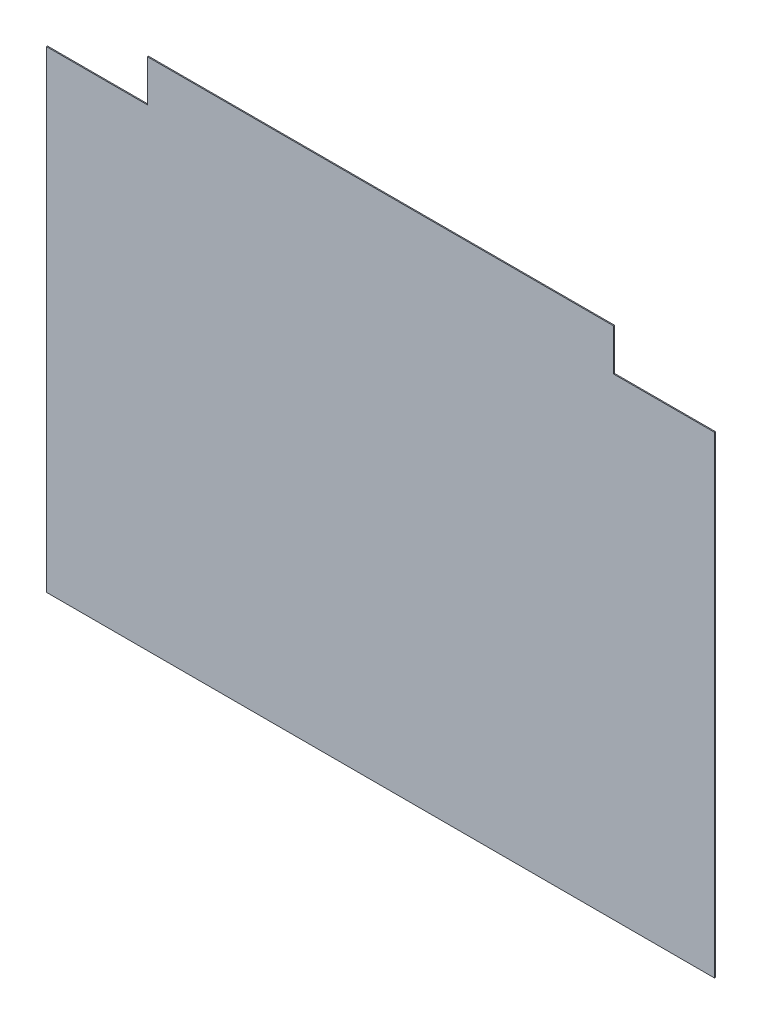
ISO-10303-21;
HEADER;
FILE_DESCRIPTION(('STEP AP214'),'2;1');
FILE_NAME('part.step','',(''),(''),'','','');
FILE_SCHEMA(('AUTOMOTIVE_DESIGN { 1 0 10303 214 1 1 1 1 }'));
ENDSEC;
DATA;
#1=APPLICATION_CONTEXT('core data for automotive mechanical design processes');
#2=APPLICATION_PROTOCOL_DEFINITION('international standard','automotive_design',2000,#1);
#3=PRODUCT_CONTEXT('',#1,'mechanical');
#4=PRODUCT('Part','Part','',(#3));
#5=PRODUCT_RELATED_PRODUCT_CATEGORY('part','',(#4));
#6=PRODUCT_DEFINITION_FORMATION('','',#4);
#7=PRODUCT_DEFINITION_CONTEXT('part definition',#1,'design');
#8=PRODUCT_DEFINITION('design','',#6,#7);
#9=PRODUCT_DEFINITION_SHAPE('','',#8);
#10=(LENGTH_UNIT() NAMED_UNIT(*) SI_UNIT(.MILLI.,.METRE.));
#11=(NAMED_UNIT(*) PLANE_ANGLE_UNIT() SI_UNIT($,.RADIAN.));
#12=(NAMED_UNIT(*) SI_UNIT($,.STERADIAN.) SOLID_ANGLE_UNIT());
#13=UNCERTAINTY_MEASURE_WITH_UNIT(LENGTH_MEASURE(1.E-05),#10,'distance_accuracy_value','');
#14=(GEOMETRIC_REPRESENTATION_CONTEXT(3) GLOBAL_UNCERTAINTY_ASSIGNED_CONTEXT((#13)) GLOBAL_UNIT_ASSIGNED_CONTEXT((#10,
#11,#12)) REPRESENTATION_CONTEXT('',''));
#15=CARTESIAN_POINT('',(0.,0.,0.));
#16=DIRECTION('',(0.,0.,1.));
#17=DIRECTION('',(1.,0.,0.));
#18=AXIS2_PLACEMENT_3D('',#15,#16,#17);
#19=CARTESIAN_POINT('',(-480.5,740.,-1.5));
#20=DIRECTION('',(0.,1.,0.));
#21=DIRECTION('',(-1.,0.,0.));
#22=AXIS2_PLACEMENT_3D('',#19,#20,#21);
#23=PLANE('',#22);
#24=DIRECTION('',(-1.,0.,0.));
#25=VECTOR('',#24,1.);
#26=CARTESIAN_POINT('',(-480.5,740.,0.));
#27=LINE('',#26,#25);
#28=CARTESIAN_POINT('',(335.5,740.,0.));
#29=VERTEX_POINT('',#28);
#30=CARTESIAN_POINT('',(-335.5,740.,0.));
#31=VERTEX_POINT('',#30);
#32=EDGE_CURVE('E151',#29,#31,#27,.T.);
#33=ORIENTED_EDGE('',*,*,#32,.F.);
#34=DIRECTION('',(0.,0.,1.));
#35=VECTOR('',#34,1.);
#36=CARTESIAN_POINT('',(335.5,740.,-1.501));
#37=LINE('',#36,#35);
#38=CARTESIAN_POINT('',(335.5,740.,-1.5));
#39=VERTEX_POINT('',#38);
#40=EDGE_CURVE('E55',#39,#29,#37,.T.);
#41=ORIENTED_EDGE('',*,*,#40,.F.);
#42=DIRECTION('',(-1.,0.,0.));
#43=VECTOR('',#42,1.);
#44=CARTESIAN_POINT('',(-480.5,740.,-1.5));
#45=LINE('',#44,#43);
#46=CARTESIAN_POINT('',(-335.5,740.,-1.5));
#47=VERTEX_POINT('',#46);
#48=EDGE_CURVE('E157',#39,#47,#45,.T.);
#49=ORIENTED_EDGE('',*,*,#48,.T.);
#50=DIRECTION('',(0.,0.,1.));
#51=VECTOR('',#50,1.);
#52=CARTESIAN_POINT('',(-335.5,740.,-1.501));
#53=LINE('',#52,#51);
#54=EDGE_CURVE('E138',#47,#31,#53,.T.);
#55=ORIENTED_EDGE('',*,*,#54,.T.);
#56=EDGE_LOOP('',(#33,#41,#49,#55));
#57=FACE_BOUND('',#56,.T.);
#58=ADVANCED_FACE('F40',(#57),#23,.T.);
#59=CARTESIAN_POINT('',(480.5,1.17688557398061E-13,-1.5));
#60=DIRECTION('',(1.,0.,0.));
#61=DIRECTION('',(0.,1.,0.));
#62=AXIS2_PLACEMENT_3D('',#59,#60,#61);
#63=PLANE('',#62);
#64=DIRECTION('',(0.,1.,0.));
#65=VECTOR('',#64,1.);
#66=CARTESIAN_POINT('',(480.5,1.17688557398061E-13,-1.5));
#67=LINE('',#66,#65);
#68=CARTESIAN_POINT('',(480.5,1.17688557398061E-13,-1.5));
#69=VERTEX_POINT('',#68);
#70=CARTESIAN_POINT('',(480.5,680.,-1.5));
#71=VERTEX_POINT('',#70);
#72=EDGE_CURVE('E154',#69,#71,#67,.T.);
#73=ORIENTED_EDGE('',*,*,#72,.T.);
#74=DIRECTION('',(0.,0.,1.));
#75=VECTOR('',#74,1.);
#76=CARTESIAN_POINT('',(480.5,680.,-1.501));
#77=LINE('',#76,#75);
#78=CARTESIAN_POINT('',(480.5,680.,0.));
#79=VERTEX_POINT('',#78);
#80=EDGE_CURVE('E113',#71,#79,#77,.T.);
#81=ORIENTED_EDGE('',*,*,#80,.T.);
#82=DIRECTION('',(0.,1.,0.));
#83=VECTOR('',#82,1.);
#84=CARTESIAN_POINT('',(480.5,1.17688557398061E-13,0.));
#85=LINE('',#84,#83);
#86=CARTESIAN_POINT('',(480.5,1.17688557398061E-13,0.));
#87=VERTEX_POINT('',#86);
#88=EDGE_CURVE('E124',#87,#79,#85,.T.);
#89=ORIENTED_EDGE('',*,*,#88,.F.);
#90=DIRECTION('',(0.,0.,1.));
#91=VECTOR('',#90,1.);
#92=CARTESIAN_POINT('',(480.5,1.17688557398061E-13,-1.5));
#93=LINE('',#92,#91);
#94=EDGE_CURVE('E11',#69,#87,#93,.T.);
#95=ORIENTED_EDGE('',*,*,#94,.F.);
#96=EDGE_LOOP('',(#73,#81,#89,#95));
#97=FACE_BOUND('',#96,.T.);
#98=ADVANCED_FACE('F185',(#97),#63,.T.);
#99=CARTESIAN_POINT('',(0.,0.,-1.5));
#100=DIRECTION('',(0.,0.,-1.));
#101=DIRECTION('',(-1.,0.,0.));
#102=AXIS2_PLACEMENT_3D('',#99,#100,#101);
#103=PLANE('',#102);
#104=DIRECTION('',(0.,1.,0.));
#105=VECTOR('',#104,1.);
#106=CARTESIAN_POINT('',(335.5,740.,-1.5));
#107=LINE('',#106,#105);
#108=CARTESIAN_POINT('',(335.5,680.,-1.5));
#109=VERTEX_POINT('',#108);
#110=EDGE_CURVE('E172',#109,#39,#107,.T.);
#111=ORIENTED_EDGE('',*,*,#110,.F.);
#112=DIRECTION('',(-1.,0.,0.));
#113=VECTOR('',#112,1.);
#114=CARTESIAN_POINT('',(480.5,680.,-1.5));
#115=LINE('',#114,#113);
#116=EDGE_CURVE('E111',#71,#109,#115,.T.);
#117=ORIENTED_EDGE('',*,*,#116,.F.);
#118=ORIENTED_EDGE('',*,*,#72,.F.);
#119=DIRECTION('',(1.,0.,0.));
#120=VECTOR('',#119,1.);
#121=CARTESIAN_POINT('',(-480.5,0.,-1.5));
#122=LINE('',#121,#120);
#123=CARTESIAN_POINT('',(-480.5,0.,-1.5));
#124=VERTEX_POINT('',#123);
#125=EDGE_CURVE('E150',#124,#69,#122,.T.);
#126=ORIENTED_EDGE('',*,*,#125,.F.);
#127=DIRECTION('',(0.,-1.,0.));
#128=VECTOR('',#127,1.);
#129=CARTESIAN_POINT('',(-480.5,0.,-1.5));
#130=LINE('',#129,#128);
#131=CARTESIAN_POINT('',(-480.5,680.,-1.5));
#132=VERTEX_POINT('',#131);
#133=EDGE_CURVE('E148',#132,#124,#130,.T.);
#134=ORIENTED_EDGE('',*,*,#133,.F.);
#135=DIRECTION('',(1.,0.,0.));
#136=VECTOR('',#135,1.);
#137=CARTESIAN_POINT('',(-480.5,680.,-1.5));
#138=LINE('',#137,#136);
#139=CARTESIAN_POINT('',(-335.5,680.,-1.5));
#140=VERTEX_POINT('',#139);
#141=EDGE_CURVE('E141',#132,#140,#138,.T.);
#142=ORIENTED_EDGE('',*,*,#141,.T.);
#143=DIRECTION('',(0.,1.,0.));
#144=VECTOR('',#143,1.);
#145=CARTESIAN_POINT('',(-335.5,740.,-1.5));
#146=LINE('',#145,#144);
#147=EDGE_CURVE('E129',#140,#47,#146,.T.);
#148=ORIENTED_EDGE('',*,*,#147,.T.);
#149=ORIENTED_EDGE('',*,*,#48,.F.);
#150=EDGE_LOOP('',(#111,#117,#118,#126,#134,#142,#148,#149));
#151=FACE_BOUND('',#150,.T.);
#152=ADVANCED_FACE('F171',(#151),#103,.T.);
#153=CARTESIAN_POINT('',(0.,0.,0.));
#154=DIRECTION('',(0.,0.,-1.));
#155=DIRECTION('',(-1.,0.,0.));
#156=AXIS2_PLACEMENT_3D('',#153,#154,#155);
#157=PLANE('',#156);
#158=DIRECTION('',(-1.,0.,0.));
#159=VECTOR('',#158,1.);
#160=CARTESIAN_POINT('',(480.5,680.,0.));
#161=LINE('',#160,#159);
#162=CARTESIAN_POINT('',(335.5,680.,0.));
#163=VERTEX_POINT('',#162);
#164=EDGE_CURVE('E108',#79,#163,#161,.T.);
#165=ORIENTED_EDGE('',*,*,#164,.T.);
#166=DIRECTION('',(0.,1.,0.));
#167=VECTOR('',#166,1.);
#168=CARTESIAN_POINT('',(335.5,740.,0.));
#169=LINE('',#168,#167);
#170=EDGE_CURVE('E115',#163,#29,#169,.T.);
#171=ORIENTED_EDGE('',*,*,#170,.T.);
#172=ORIENTED_EDGE('',*,*,#32,.T.);
#173=DIRECTION('',(0.,1.,0.));
#174=VECTOR('',#173,1.);
#175=CARTESIAN_POINT('',(-335.5,740.,0.));
#176=LINE('',#175,#174);
#177=CARTESIAN_POINT('',(-335.5,680.,0.));
#178=VERTEX_POINT('',#177);
#179=EDGE_CURVE('E135',#178,#31,#176,.T.);
#180=ORIENTED_EDGE('',*,*,#179,.F.);
#181=DIRECTION('',(1.,0.,0.));
#182=VECTOR('',#181,1.);
#183=CARTESIAN_POINT('',(-480.5,680.,0.));
#184=LINE('',#183,#182);
#185=CARTESIAN_POINT('',(-480.5,680.,0.));
#186=VERTEX_POINT('',#185);
#187=EDGE_CURVE('E133',#186,#178,#184,.T.);
#188=ORIENTED_EDGE('',*,*,#187,.F.);
#189=DIRECTION('',(0.,-1.,0.));
#190=VECTOR('',#189,1.);
#191=CARTESIAN_POINT('',(-480.5,0.,0.));
#192=LINE('',#191,#190);
#193=CARTESIAN_POINT('',(-480.5,0.,0.));
#194=VERTEX_POINT('',#193);
#195=EDGE_CURVE('E147',#186,#194,#192,.T.);
#196=ORIENTED_EDGE('',*,*,#195,.T.);
#197=DIRECTION('',(1.,0.,0.));
#198=VECTOR('',#197,1.);
#199=CARTESIAN_POINT('',(-480.5,0.,0.));
#200=LINE('',#199,#198);
#201=EDGE_CURVE('E160',#194,#87,#200,.T.);
#202=ORIENTED_EDGE('',*,*,#201,.T.);
#203=ORIENTED_EDGE('',*,*,#88,.T.);
#204=EDGE_LOOP('',(#165,#171,#172,#180,#188,#196,#202,#203));
#205=FACE_BOUND('',#204,.T.);
#206=ADVANCED_FACE('F121',(#205),#157,.F.);
#207=CARTESIAN_POINT('',(-480.5,0.,-1.5));
#208=DIRECTION('',(-1.,0.,0.));
#209=DIRECTION('',(0.,0.,1.));
#210=AXIS2_PLACEMENT_3D('',#207,#208,#209);
#211=PLANE('',#210);
#212=DIRECTION('',(0.,0.,1.));
#213=VECTOR('',#212,1.);
#214=CARTESIAN_POINT('',(-480.5,680.,-1.501));
#215=LINE('',#214,#213);
#216=EDGE_CURVE('E63',#132,#186,#215,.T.);
#217=ORIENTED_EDGE('',*,*,#216,.F.);
#218=ORIENTED_EDGE('',*,*,#133,.T.);
#219=DIRECTION('',(0.,0.,1.));
#220=VECTOR('',#219,1.);
#221=CARTESIAN_POINT('',(-480.5,0.,-1.5));
#222=LINE('',#221,#220);
#223=EDGE_CURVE('E44',#124,#194,#222,.T.);
#224=ORIENTED_EDGE('',*,*,#223,.T.);
#225=ORIENTED_EDGE('',*,*,#195,.F.);
#226=EDGE_LOOP('',(#217,#218,#224,#225));
#227=FACE_BOUND('',#226,.T.);
#228=ADVANCED_FACE('F42',(#227),#211,.T.);
#229=CARTESIAN_POINT('',(-480.5,0.,-1.5));
#230=DIRECTION('',(0.,-1.,0.));
#231=DIRECTION('',(1.,0.,0.));
#232=AXIS2_PLACEMENT_3D('',#229,#230,#231);
#233=PLANE('',#232);
#234=ORIENTED_EDGE('',*,*,#201,.F.);
#235=ORIENTED_EDGE('',*,*,#223,.F.);
#236=ORIENTED_EDGE('',*,*,#125,.T.);
#237=ORIENTED_EDGE('',*,*,#94,.T.);
#238=EDGE_LOOP('',(#234,#235,#236,#237));
#239=FACE_BOUND('',#238,.T.);
#240=ADVANCED_FACE('F182',(#239),#233,.T.);
#241=CARTESIAN_POINT('',(-335.5,740.,-1.501));
#242=DIRECTION('',(1.,0.,0.));
#243=DIRECTION('',(0.,0.,-1.));
#244=AXIS2_PLACEMENT_3D('',#241,#242,#243);
#245=PLANE('',#244);
#246=DIRECTION('',(0.,0.,1.));
#247=VECTOR('',#246,1.);
#248=CARTESIAN_POINT('',(-335.5,680.,-1.501));
#249=LINE('',#248,#247);
#250=EDGE_CURVE('E142',#140,#178,#249,.T.);
#251=ORIENTED_EDGE('',*,*,#250,.T.);
#252=ORIENTED_EDGE('',*,*,#179,.T.);
#253=ORIENTED_EDGE('',*,*,#54,.F.);
#254=ORIENTED_EDGE('',*,*,#147,.F.);
#255=EDGE_LOOP('',(#251,#252,#253,#254));
#256=FACE_BOUND('',#255,.T.);
#257=ADVANCED_FACE('F167',(#256),#245,.F.);
#258=CARTESIAN_POINT('',(-480.5,680.,-1.501));
#259=DIRECTION('',(0.,-1.,0.));
#260=DIRECTION('',(0.,0.,-1.));
#261=AXIS2_PLACEMENT_3D('',#258,#259,#260);
#262=PLANE('',#261);
#263=ORIENTED_EDGE('',*,*,#216,.T.);
#264=ORIENTED_EDGE('',*,*,#187,.T.);
#265=ORIENTED_EDGE('',*,*,#250,.F.);
#266=ORIENTED_EDGE('',*,*,#141,.F.);
#267=EDGE_LOOP('',(#263,#264,#265,#266));
#268=FACE_BOUND('',#267,.T.);
#269=ADVANCED_FACE('F174',(#268),#262,.F.);
#270=CARTESIAN_POINT('',(480.5,680.,-1.501));
#271=DIRECTION('',(0.,1.,0.));
#272=DIRECTION('',(0.,0.,1.));
#273=AXIS2_PLACEMENT_3D('',#270,#271,#272);
#274=PLANE('',#273);
#275=ORIENTED_EDGE('',*,*,#116,.T.);
#276=DIRECTION('',(0.,0.,1.));
#277=VECTOR('',#276,1.);
#278=CARTESIAN_POINT('',(335.5,680.,-1.501));
#279=LINE('',#278,#277);
#280=EDGE_CURVE('E105',#109,#163,#279,.T.);
#281=ORIENTED_EDGE('',*,*,#280,.T.);
#282=ORIENTED_EDGE('',*,*,#164,.F.);
#283=ORIENTED_EDGE('',*,*,#80,.F.);
#284=EDGE_LOOP('',(#275,#281,#282,#283));
#285=FACE_BOUND('',#284,.T.);
#286=ADVANCED_FACE('F106',(#285),#274,.T.);
#287=CARTESIAN_POINT('',(335.5,740.,-1.501));
#288=DIRECTION('',(1.,0.,0.));
#289=DIRECTION('',(0.,0.,-1.));
#290=AXIS2_PLACEMENT_3D('',#287,#288,#289);
#291=PLANE('',#290);
#292=ORIENTED_EDGE('',*,*,#110,.T.);
#293=ORIENTED_EDGE('',*,*,#40,.T.);
#294=ORIENTED_EDGE('',*,*,#170,.F.);
#295=ORIENTED_EDGE('',*,*,#280,.F.);
#296=EDGE_LOOP('',(#292,#293,#294,#295));
#297=FACE_BOUND('',#296,.T.);
#298=ADVANCED_FACE('F116',(#297),#291,.T.);
#299=CLOSED_SHELL('',(#58,#98,#152,#206,#228,#240,#257,#269,#286,#298));
#300=MANIFOLD_SOLID_BREP('B2',#299);
#301=ADVANCED_BREP_SHAPE_REPRESENTATION('',(#18,#300),#14);
#302=SHAPE_DEFINITION_REPRESENTATION(#9,#301);
ENDSEC;
END-ISO-10303-21;
